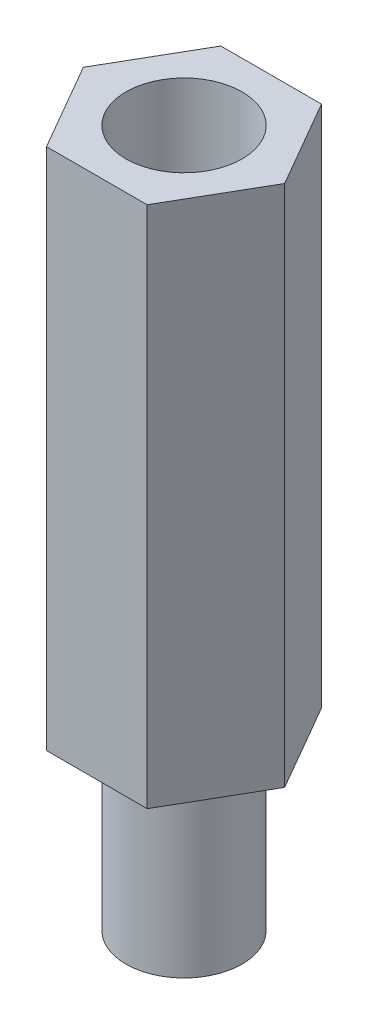
ISO-10303-21;
HEADER;
FILE_DESCRIPTION(('STEP AP214'),'2;1');
FILE_NAME('part.step','',(''),(''),'','','');
FILE_SCHEMA(('AUTOMOTIVE_DESIGN { 1 0 10303 214 1 1 1 1 }'));
ENDSEC;
DATA;
#1=APPLICATION_CONTEXT('core data for automotive mechanical design processes');
#2=APPLICATION_PROTOCOL_DEFINITION('international standard','automotive_design',2000,#1);
#3=PRODUCT_CONTEXT('',#1,'mechanical');
#4=PRODUCT('Part','Part','',(#3));
#5=PRODUCT_RELATED_PRODUCT_CATEGORY('part','',(#4));
#6=PRODUCT_DEFINITION_FORMATION('','',#4);
#7=PRODUCT_DEFINITION_CONTEXT('part definition',#1,'design');
#8=PRODUCT_DEFINITION('design','',#6,#7);
#9=PRODUCT_DEFINITION_SHAPE('','',#8);
#10=(LENGTH_UNIT() NAMED_UNIT(*) SI_UNIT(.MILLI.,.METRE.));
#11=(NAMED_UNIT(*) PLANE_ANGLE_UNIT() SI_UNIT($,.RADIAN.));
#12=(NAMED_UNIT(*) SI_UNIT($,.STERADIAN.) SOLID_ANGLE_UNIT());
#13=UNCERTAINTY_MEASURE_WITH_UNIT(LENGTH_MEASURE(1.E-05),#10,'distance_accuracy_value','');
#14=(GEOMETRIC_REPRESENTATION_CONTEXT(3) GLOBAL_UNCERTAINTY_ASSIGNED_CONTEXT((#13)) GLOBAL_UNIT_ASSIGNED_CONTEXT((#10,
#11,#12)) REPRESENTATION_CONTEXT('',''));
#15=CARTESIAN_POINT('',(0.,0.,0.));
#16=DIRECTION('',(0.,0.,1.));
#17=DIRECTION('',(1.,0.,0.));
#18=AXIS2_PLACEMENT_3D('',#15,#16,#17);
#19=CARTESIAN_POINT('',(0.,-6.,0.));
#20=DIRECTION('',(0.,1.,0.));
#21=DIRECTION('',(0.,0.,1.));
#22=AXIS2_PLACEMENT_3D('',#19,#20,#21);
#23=CYLINDRICAL_SURFACE('',#22,2.);
#24=CARTESIAN_POINT('',(0.,-6.,0.));
#25=DIRECTION('',(0.,1.,0.));
#26=DIRECTION('',(0.,0.,1.));
#27=AXIS2_PLACEMENT_3D('',#24,#25,#26);
#28=CIRCLE('',#27,2.);
#29=CARTESIAN_POINT('',(0.,-6.,2.));
#30=VERTEX_POINT('',#29);
#31=EDGE_CURVE('E11',#30,#30,#28,.T.);
#32=ORIENTED_EDGE('',*,*,#31,.T.);
#33=EDGE_LOOP('',(#32));
#34=FACE_BOUND('',#33,.T.);
#35=CARTESIAN_POINT('',(0.,0.,0.));
#36=DIRECTION('',(0.,1.,0.));
#37=DIRECTION('',(0.,0.,1.));
#38=AXIS2_PLACEMENT_3D('',#35,#36,#37);
#39=CIRCLE('',#38,2.);
#40=CARTESIAN_POINT('',(0.,0.,2.));
#41=VERTEX_POINT('',#40);
#42=EDGE_CURVE('E50',#41,#41,#39,.T.);
#43=ORIENTED_EDGE('',*,*,#42,.F.);
#44=EDGE_LOOP('',(#43));
#45=FACE_BOUND('',#44,.T.);
#46=ADVANCED_FACE('F47',(#34,#45),#23,.T.);
#47=CARTESIAN_POINT('',(0.,-6.,0.));
#48=DIRECTION('',(0.,1.,0.));
#49=DIRECTION('',(0.,0.,1.));
#50=AXIS2_PLACEMENT_3D('',#47,#48,#49);
#51=PLANE('',#50);
#52=ORIENTED_EDGE('',*,*,#31,.F.);
#53=EDGE_LOOP('',(#52));
#54=FACE_BOUND('',#53,.T.);
#55=ADVANCED_FACE('F62',(#54),#51,.F.);
#56=CARTESIAN_POINT('',(0.,0.,0.));
#57=DIRECTION('',(0.,1.,0.));
#58=DIRECTION('',(0.,0.,1.));
#59=AXIS2_PLACEMENT_3D('',#56,#57,#58);
#60=PLANE('',#59);
#61=ORIENTED_EDGE('',*,*,#42,.T.);
#62=EDGE_LOOP('',(#61));
#63=FACE_BOUND('',#62,.T.);
#64=ADVANCED_FACE('F59',(#63),#60,.T.);
#65=CLOSED_SHELL('',(#46,#55,#64));
#66=MANIFOLD_SOLID_BREP('B2',#65);
#67=CARTESIAN_POINT('',(0.,18.,0.));
#68=DIRECTION('',(0.,1.,0.));
#69=DIRECTION('',(0.,0.,1.));
#70=AXIS2_PLACEMENT_3D('',#67,#68,#69);
#71=PLANE('',#70);
#72=DIRECTION('',(0.5,0.,-0.866025403784439));
#73=VECTOR('',#72,1.);
#74=CARTESIAN_POINT('',(1.73205080756889,18.,3.));
#75=LINE('',#74,#73);
#76=CARTESIAN_POINT('',(1.73205080756889,18.,3.));
#77=VERTEX_POINT('',#76);
#78=CARTESIAN_POINT('',(3.46410161513776,18.,0.));
#79=VERTEX_POINT('',#78);
#80=EDGE_CURVE('E195',#77,#79,#75,.T.);
#81=ORIENTED_EDGE('',*,*,#80,.T.);
#82=DIRECTION('',(-0.499999999999999,0.,-0.866025403784439));
#83=VECTOR('',#82,1.);
#84=CARTESIAN_POINT('',(3.46410161513776,18.,0.));
#85=LINE('',#84,#83);
#86=CARTESIAN_POINT('',(1.73205080756888,18.,-3.));
#87=VERTEX_POINT('',#86);
#88=EDGE_CURVE('E143',#79,#87,#85,.T.);
#89=ORIENTED_EDGE('',*,*,#88,.T.);
#90=DIRECTION('',(-1.,0.,0.));
#91=VECTOR('',#90,1.);
#92=CARTESIAN_POINT('',(1.73205080756888,18.,-3.));
#93=LINE('',#92,#91);
#94=CARTESIAN_POINT('',(-1.73205080756888,18.,-3.));
#95=VERTEX_POINT('',#94);
#96=EDGE_CURVE('E156',#87,#95,#93,.T.);
#97=ORIENTED_EDGE('',*,*,#96,.T.);
#98=DIRECTION('',(-0.500000000000001,0.,0.866025403784438));
#99=VECTOR('',#98,1.);
#100=CARTESIAN_POINT('',(-1.73205080756888,18.,-3.));
#101=LINE('',#100,#99);
#102=CARTESIAN_POINT('',(-3.46410161513776,18.,0.));
#103=VERTEX_POINT('',#102);
#104=EDGE_CURVE('E150',#95,#103,#101,.T.);
#105=ORIENTED_EDGE('',*,*,#104,.T.);
#106=DIRECTION('',(0.5,0.,0.866025403784439));
#107=VECTOR('',#106,1.);
#108=CARTESIAN_POINT('',(-3.46410161513776,18.,0.));
#109=LINE('',#108,#107);
#110=CARTESIAN_POINT('',(-1.73205080756888,18.,3.));
#111=VERTEX_POINT('',#110);
#112=EDGE_CURVE('E154',#103,#111,#109,.T.);
#113=ORIENTED_EDGE('',*,*,#112,.T.);
#114=DIRECTION('',(1.,0.,0.));
#115=VECTOR('',#114,1.);
#116=CARTESIAN_POINT('',(-1.73205080756888,18.,3.));
#117=LINE('',#116,#115);
#118=EDGE_CURVE('E106',#111,#77,#117,.T.);
#119=ORIENTED_EDGE('',*,*,#118,.T.);
#120=EDGE_LOOP('',(#81,#89,#97,#105,#113,#119));
#121=FACE_BOUND('',#120,.T.);
#122=CARTESIAN_POINT('',(0.,18.,0.));
#123=DIRECTION('',(0.,1.,0.));
#124=DIRECTION('',(0.,0.,1.));
#125=AXIS2_PLACEMENT_3D('',#122,#123,#124);
#126=CIRCLE('',#125,2.);
#127=CARTESIAN_POINT('',(0.,18.,2.));
#128=VERTEX_POINT('',#127);
#129=EDGE_CURVE('E183',#128,#128,#126,.T.);
#130=ORIENTED_EDGE('',*,*,#129,.F.);
#131=EDGE_LOOP('',(#130));
#132=FACE_BOUND('',#131,.T.);
#133=ADVANCED_FACE('F88',(#121,#132),#71,.T.);
#134=CARTESIAN_POINT('',(0.,0.,0.));
#135=DIRECTION('',(0.,1.,0.));
#136=DIRECTION('',(0.,0.,1.));
#137=AXIS2_PLACEMENT_3D('',#134,#135,#136);
#138=PLANE('',#137);
#139=DIRECTION('',(0.5,0.,-0.866025403784439));
#140=VECTOR('',#139,1.);
#141=CARTESIAN_POINT('',(1.73205080756889,0.,3.));
#142=LINE('',#141,#140);
#143=CARTESIAN_POINT('',(1.73205080756889,0.,3.));
#144=VERTEX_POINT('',#143);
#145=CARTESIAN_POINT('',(3.46410161513776,0.,0.));
#146=VERTEX_POINT('',#145);
#147=EDGE_CURVE('E178',#144,#146,#142,.T.);
#148=ORIENTED_EDGE('',*,*,#147,.F.);
#149=DIRECTION('',(1.,0.,0.));
#150=VECTOR('',#149,1.);
#151=CARTESIAN_POINT('',(-1.73205080756888,0.,3.));
#152=LINE('',#151,#150);
#153=CARTESIAN_POINT('',(-1.73205080756888,0.,3.));
#154=VERTEX_POINT('',#153);
#155=EDGE_CURVE('E135',#154,#144,#152,.T.);
#156=ORIENTED_EDGE('',*,*,#155,.F.);
#157=DIRECTION('',(0.5,0.,0.866025403784439));
#158=VECTOR('',#157,1.);
#159=CARTESIAN_POINT('',(-3.46410161513776,0.,0.));
#160=LINE('',#159,#158);
#161=CARTESIAN_POINT('',(-3.46410161513776,0.,0.));
#162=VERTEX_POINT('',#161);
#163=EDGE_CURVE('E129',#162,#154,#160,.T.);
#164=ORIENTED_EDGE('',*,*,#163,.F.);
#165=DIRECTION('',(-0.500000000000001,0.,0.866025403784438));
#166=VECTOR('',#165,1.);
#167=CARTESIAN_POINT('',(-1.73205080756888,0.,-3.));
#168=LINE('',#167,#166);
#169=CARTESIAN_POINT('',(-1.73205080756888,0.,-3.));
#170=VERTEX_POINT('',#169);
#171=EDGE_CURVE('E165',#170,#162,#168,.T.);
#172=ORIENTED_EDGE('',*,*,#171,.F.);
#173=DIRECTION('',(-1.,0.,0.));
#174=VECTOR('',#173,1.);
#175=CARTESIAN_POINT('',(1.73205080756888,0.,-3.));
#176=LINE('',#175,#174);
#177=CARTESIAN_POINT('',(1.73205080756888,0.,-3.));
#178=VERTEX_POINT('',#177);
#179=EDGE_CURVE('E186',#178,#170,#176,.T.);
#180=ORIENTED_EDGE('',*,*,#179,.F.);
#181=DIRECTION('',(-0.499999999999999,0.,-0.866025403784439));
#182=VECTOR('',#181,1.);
#183=CARTESIAN_POINT('',(3.46410161513776,0.,0.));
#184=LINE('',#183,#182);
#185=EDGE_CURVE('E182',#146,#178,#184,.T.);
#186=ORIENTED_EDGE('',*,*,#185,.F.);
#187=EDGE_LOOP('',(#148,#156,#164,#172,#180,#186));
#188=FACE_BOUND('',#187,.T.);
#189=CARTESIAN_POINT('',(0.,0.,0.));
#190=DIRECTION('',(0.,1.,0.));
#191=DIRECTION('',(0.,0.,1.));
#192=AXIS2_PLACEMENT_3D('',#189,#190,#191);
#193=CIRCLE('',#192,2.);
#194=CARTESIAN_POINT('',(0.,0.,2.));
#195=VERTEX_POINT('',#194);
#196=EDGE_CURVE('E292',#195,#195,#193,.T.);
#197=ORIENTED_EDGE('',*,*,#196,.T.);
#198=EDGE_LOOP('',(#197));
#199=FACE_BOUND('',#198,.T.);
#200=ADVANCED_FACE('F208',(#188,#199),#138,.F.);
#201=CARTESIAN_POINT('',(1.73205080756889,18.,3.));
#202=DIRECTION('',(-0.866025403784439,0.,-0.5));
#203=DIRECTION('',(-0.5,0.,0.866025403784439));
#204=AXIS2_PLACEMENT_3D('',#201,#202,#203);
#205=PLANE('',#204);
#206=ORIENTED_EDGE('',*,*,#147,.T.);
#207=DIRECTION('',(0.,-1.,0.));
#208=VECTOR('',#207,1.);
#209=CARTESIAN_POINT('',(3.46410161513776,18.,0.));
#210=LINE('',#209,#208);
#211=EDGE_CURVE('E45',#79,#146,#210,.T.);
#212=ORIENTED_EDGE('',*,*,#211,.F.);
#213=ORIENTED_EDGE('',*,*,#80,.F.);
#214=DIRECTION('',(0.,-1.,0.));
#215=VECTOR('',#214,1.);
#216=CARTESIAN_POINT('',(1.73205080756889,18.,3.));
#217=LINE('',#216,#215);
#218=EDGE_CURVE('E174',#77,#144,#217,.T.);
#219=ORIENTED_EDGE('',*,*,#218,.T.);
#220=EDGE_LOOP('',(#206,#212,#213,#219));
#221=FACE_BOUND('',#220,.T.);
#222=ADVANCED_FACE('F90',(#221),#205,.F.);
#223=CARTESIAN_POINT('',(3.46410161513776,18.,0.));
#224=DIRECTION('',(-0.866025403784439,0.,0.499999999999999));
#225=DIRECTION('',(0.5,0.,0.866025403784439));
#226=AXIS2_PLACEMENT_3D('',#223,#224,#225);
#227=PLANE('',#226);
#228=ORIENTED_EDGE('',*,*,#185,.T.);
#229=DIRECTION('',(0.,-1.,0.));
#230=VECTOR('',#229,1.);
#231=CARTESIAN_POINT('',(1.73205080756888,18.,-3.));
#232=LINE('',#231,#230);
#233=EDGE_CURVE('E98',#87,#178,#232,.T.);
#234=ORIENTED_EDGE('',*,*,#233,.F.);
#235=ORIENTED_EDGE('',*,*,#88,.F.);
#236=ORIENTED_EDGE('',*,*,#211,.T.);
#237=EDGE_LOOP('',(#228,#234,#235,#236));
#238=FACE_BOUND('',#237,.T.);
#239=ADVANCED_FACE('F233',(#238),#227,.F.);
#240=CARTESIAN_POINT('',(1.73205080756888,18.,-3.));
#241=DIRECTION('',(0.,0.,1.));
#242=DIRECTION('',(1.,0.,0.));
#243=AXIS2_PLACEMENT_3D('',#240,#241,#242);
#244=PLANE('',#243);
#245=ORIENTED_EDGE('',*,*,#179,.T.);
#246=DIRECTION('',(0.,-1.,0.));
#247=VECTOR('',#246,1.);
#248=CARTESIAN_POINT('',(-1.73205080756888,18.,-3.));
#249=LINE('',#248,#247);
#250=EDGE_CURVE('E167',#95,#170,#249,.T.);
#251=ORIENTED_EDGE('',*,*,#250,.F.);
#252=ORIENTED_EDGE('',*,*,#96,.F.);
#253=ORIENTED_EDGE('',*,*,#233,.T.);
#254=EDGE_LOOP('',(#245,#251,#252,#253));
#255=FACE_BOUND('',#254,.T.);
#256=ADVANCED_FACE('F205',(#255),#244,.F.);
#257=CARTESIAN_POINT('',(-1.73205080756888,18.,-3.));
#258=DIRECTION('',(0.866025403784438,0.,0.500000000000001));
#259=DIRECTION('',(0.500000000000001,0.,-0.866025403784438));
#260=AXIS2_PLACEMENT_3D('',#257,#258,#259);
#261=PLANE('',#260);
#262=ORIENTED_EDGE('',*,*,#171,.T.);
#263=DIRECTION('',(0.,-1.,0.));
#264=VECTOR('',#263,1.);
#265=CARTESIAN_POINT('',(-3.46410161513776,18.,0.));
#266=LINE('',#265,#264);
#267=EDGE_CURVE('E162',#103,#162,#266,.T.);
#268=ORIENTED_EDGE('',*,*,#267,.F.);
#269=ORIENTED_EDGE('',*,*,#104,.F.);
#270=ORIENTED_EDGE('',*,*,#250,.T.);
#271=EDGE_LOOP('',(#262,#268,#269,#270));
#272=FACE_BOUND('',#271,.T.);
#273=ADVANCED_FACE('F163',(#272),#261,.F.);
#274=CARTESIAN_POINT('',(-3.46410161513776,18.,0.));
#275=DIRECTION('',(0.866025403784439,0.,-0.5));
#276=DIRECTION('',(-0.5,0.,-0.866025403784439));
#277=AXIS2_PLACEMENT_3D('',#274,#275,#276);
#278=PLANE('',#277);
#279=ORIENTED_EDGE('',*,*,#163,.T.);
#280=DIRECTION('',(0.,-1.,0.));
#281=VECTOR('',#280,1.);
#282=CARTESIAN_POINT('',(-1.73205080756888,18.,3.));
#283=LINE('',#282,#281);
#284=EDGE_CURVE('E168',#111,#154,#283,.T.);
#285=ORIENTED_EDGE('',*,*,#284,.F.);
#286=ORIENTED_EDGE('',*,*,#112,.F.);
#287=ORIENTED_EDGE('',*,*,#267,.T.);
#288=EDGE_LOOP('',(#279,#285,#286,#287));
#289=FACE_BOUND('',#288,.T.);
#290=ADVANCED_FACE('F170',(#289),#278,.F.);
#291=CARTESIAN_POINT('',(-1.73205080756888,18.,3.));
#292=DIRECTION('',(0.,0.,-1.));
#293=DIRECTION('',(-1.,0.,0.));
#294=AXIS2_PLACEMENT_3D('',#291,#292,#293);
#295=PLANE('',#294);
#296=ORIENTED_EDGE('',*,*,#155,.T.);
#297=ORIENTED_EDGE('',*,*,#218,.F.);
#298=ORIENTED_EDGE('',*,*,#118,.F.);
#299=ORIENTED_EDGE('',*,*,#284,.T.);
#300=EDGE_LOOP('',(#296,#297,#298,#299));
#301=FACE_BOUND('',#300,.T.);
#302=ADVANCED_FACE('F213',(#301),#295,.F.);
#303=CARTESIAN_POINT('',(0.,18.,0.));
#304=DIRECTION('',(0.,-1.,0.));
#305=DIRECTION('',(0.,0.,-1.));
#306=AXIS2_PLACEMENT_3D('',#303,#304,#305);
#307=CYLINDRICAL_SURFACE('',#306,2.);
#308=ORIENTED_EDGE('',*,*,#129,.T.);
#309=EDGE_LOOP('',(#308));
#310=FACE_BOUND('',#309,.T.);
#311=ORIENTED_EDGE('',*,*,#196,.F.);
#312=EDGE_LOOP('',(#311));
#313=FACE_BOUND('',#312,.T.);
#314=ADVANCED_FACE('F215',(#310,#313),#307,.F.);
#315=CLOSED_SHELL('',(#133,#200,#222,#239,#256,#273,#290,#302,#314));
#316=MANIFOLD_SOLID_BREP('B6',#315);
#317=ADVANCED_BREP_SHAPE_REPRESENTATION('',(#18,#66,#316),#14);
#318=SHAPE_DEFINITION_REPRESENTATION(#9,#317);
ENDSEC;
END-ISO-10303-21;
